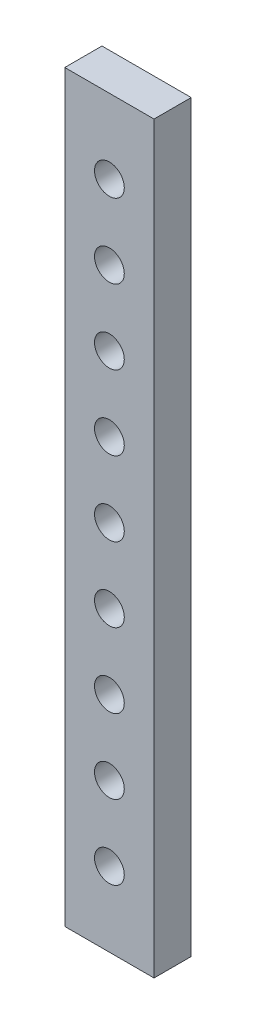
ISO-10303-21;
HEADER;
FILE_DESCRIPTION(('STEP AP214'),'2;1');
FILE_NAME('part.step','',(''),(''),'','','');
FILE_SCHEMA(('AUTOMOTIVE_DESIGN { 1 0 10303 214 1 1 1 1 }'));
ENDSEC;
DATA;
#1=APPLICATION_CONTEXT('core data for automotive mechanical design processes');
#2=APPLICATION_PROTOCOL_DEFINITION('international standard','automotive_design',2000,#1);
#3=PRODUCT_CONTEXT('',#1,'mechanical');
#4=PRODUCT('Part','Part','',(#3));
#5=PRODUCT_RELATED_PRODUCT_CATEGORY('part','',(#4));
#6=PRODUCT_DEFINITION_FORMATION('','',#4);
#7=PRODUCT_DEFINITION_CONTEXT('part definition',#1,'design');
#8=PRODUCT_DEFINITION('design','',#6,#7);
#9=PRODUCT_DEFINITION_SHAPE('','',#8);
#10=(LENGTH_UNIT() NAMED_UNIT(*) SI_UNIT(.MILLI.,.METRE.));
#11=(NAMED_UNIT(*) PLANE_ANGLE_UNIT() SI_UNIT($,.RADIAN.));
#12=(NAMED_UNIT(*) SI_UNIT($,.STERADIAN.) SOLID_ANGLE_UNIT());
#13=UNCERTAINTY_MEASURE_WITH_UNIT(LENGTH_MEASURE(1.E-05),#10,'distance_accuracy_value','');
#14=(GEOMETRIC_REPRESENTATION_CONTEXT(3) GLOBAL_UNCERTAINTY_ASSIGNED_CONTEXT((#13)) GLOBAL_UNIT_ASSIGNED_CONTEXT((#10,
#11,#12)) REPRESENTATION_CONTEXT('',''));
#15=CARTESIAN_POINT('',(0.,0.,0.));
#16=DIRECTION('',(0.,0.,1.));
#17=DIRECTION('',(1.,0.,0.));
#18=AXIS2_PLACEMENT_3D('',#15,#16,#17);
#19=CARTESIAN_POINT('',(0.,0.,5.));
#20=DIRECTION('',(0.,0.,1.));
#21=DIRECTION('',(1.,0.,0.));
#22=AXIS2_PLACEMENT_3D('',#19,#20,#21);
#23=PLANE('',#22);
#24=CARTESIAN_POINT('',(3.12396350297161E-13,-30.,5.));
#25=DIRECTION('',(0.,0.,1.));
#26=DIRECTION('',(1.,0.,0.));
#27=AXIS2_PLACEMENT_3D('',#24,#25,#26);
#28=CIRCLE('',#27,2.);
#29=CARTESIAN_POINT('',(2.00000000000031,-30.,5.));
#30=VERTEX_POINT('',#29);
#31=EDGE_CURVE('E182',#30,#30,#28,.T.);
#32=ORIENTED_EDGE('',*,*,#31,.F.);
#33=EDGE_LOOP('',(#32));
#34=FACE_BOUND('',#33,.T.);
#35=CARTESIAN_POINT('',(1.0413211676572E-13,-10.,5.));
#36=DIRECTION('',(0.,0.,1.));
#37=DIRECTION('',(1.,0.,0.));
#38=AXIS2_PLACEMENT_3D('',#35,#36,#37);
#39=CIRCLE('',#38,2.);
#40=CARTESIAN_POINT('',(2.0000000000001,-10.,5.));
#41=VERTEX_POINT('',#40);
#42=EDGE_CURVE('E166',#41,#41,#39,.T.);
#43=ORIENTED_EDGE('',*,*,#42,.F.);
#44=EDGE_LOOP('',(#43));
#45=FACE_BOUND('',#44,.T.);
#46=CARTESIAN_POINT('',(-1.02907469966573E-13,30.,5.));
#47=DIRECTION('',(0.,0.,1.));
#48=DIRECTION('',(1.,0.,0.));
#49=AXIS2_PLACEMENT_3D('',#46,#47,#48);
#50=CIRCLE('',#49,2.);
#51=CARTESIAN_POINT('',(1.9999999999999,30.,5.));
#52=VERTEX_POINT('',#51);
#53=EDGE_CURVE('E150',#52,#52,#50,.T.);
#54=ORIENTED_EDGE('',*,*,#53,.F.);
#55=EDGE_LOOP('',(#54));
#56=FACE_BOUND('',#55,.T.);
#57=CARTESIAN_POINT('',(0.,10.,5.));
#58=DIRECTION('',(0.,0.,1.));
#59=DIRECTION('',(1.,0.,0.));
#60=AXIS2_PLACEMENT_3D('',#57,#58,#59);
#61=CIRCLE('',#60,2.);
#62=CARTESIAN_POINT('',(1.99999999999997,10.,5.));
#63=VERTEX_POINT('',#62);
#64=EDGE_CURVE('E134',#63,#63,#61,.T.);
#65=ORIENTED_EDGE('',*,*,#64,.F.);
#66=EDGE_LOOP('',(#65));
#67=FACE_BOUND('',#66,.T.);
#68=DIRECTION('',(0.,1.,0.));
#69=VECTOR('',#68,1.);
#70=CARTESIAN_POINT('',(6.,50.,5.));
#71=LINE('',#70,#69);
#72=CARTESIAN_POINT('',(6.00000000000001,-50.,5.));
#73=VERTEX_POINT('',#72);
#74=CARTESIAN_POINT('',(6.,50.,5.));
#75=VERTEX_POINT('',#74);
#76=EDGE_CURVE('E92',#73,#75,#71,.T.);
#77=ORIENTED_EDGE('',*,*,#76,.T.);
#78=DIRECTION('',(-1.,0.,0.));
#79=VECTOR('',#78,1.);
#80=CARTESIAN_POINT('',(-6.,50.,5.));
#81=LINE('',#80,#79);
#82=CARTESIAN_POINT('',(-6.,50.,5.));
#83=VERTEX_POINT('',#82);
#84=EDGE_CURVE('E87',#75,#83,#81,.T.);
#85=ORIENTED_EDGE('',*,*,#84,.T.);
#86=DIRECTION('',(0.,-1.,0.));
#87=VECTOR('',#86,1.);
#88=CARTESIAN_POINT('',(-6.,50.,5.));
#89=LINE('',#88,#87);
#90=CARTESIAN_POINT('',(-5.99999999999999,-50.,5.));
#91=VERTEX_POINT('',#90);
#92=EDGE_CURVE('E90',#83,#91,#89,.T.);
#93=ORIENTED_EDGE('',*,*,#92,.T.);
#94=DIRECTION('',(1.,0.,0.));
#95=VECTOR('',#94,1.);
#96=CARTESIAN_POINT('',(-5.99999999999999,-50.,5.));
#97=LINE('',#96,#95);
#98=EDGE_CURVE('E57',#91,#73,#97,.T.);
#99=ORIENTED_EDGE('',*,*,#98,.T.);
#100=EDGE_LOOP('',(#77,#85,#93,#99));
#101=FACE_BOUND('',#100,.T.);
#102=CARTESIAN_POINT('',(0.,0.,5.));
#103=DIRECTION('',(0.,0.,1.));
#104=DIRECTION('',(1.,0.,0.));
#105=AXIS2_PLACEMENT_3D('',#102,#103,#104);
#106=CIRCLE('',#105,2.);
#107=CARTESIAN_POINT('',(2.,0.,5.));
#108=VERTEX_POINT('',#107);
#109=EDGE_CURVE('E112',#108,#108,#106,.T.);
#110=ORIENTED_EDGE('',*,*,#109,.F.);
#111=EDGE_LOOP('',(#110));
#112=FACE_BOUND('',#111,.T.);
#113=CARTESIAN_POINT('',(0.,20.,5.));
#114=DIRECTION('',(0.,0.,1.));
#115=DIRECTION('',(1.,0.,0.));
#116=AXIS2_PLACEMENT_3D('',#113,#114,#115);
#117=CIRCLE('',#116,2.);
#118=CARTESIAN_POINT('',(1.99999999999993,20.,5.));
#119=VERTEX_POINT('',#118);
#120=EDGE_CURVE('E142',#119,#119,#117,.T.);
#121=ORIENTED_EDGE('',*,*,#120,.F.);
#122=EDGE_LOOP('',(#121));
#123=FACE_BOUND('',#122,.T.);
#124=CARTESIAN_POINT('',(-1.37209959955431E-13,40.,5.));
#125=DIRECTION('',(0.,0.,1.));
#126=DIRECTION('',(1.,0.,0.));
#127=AXIS2_PLACEMENT_3D('',#124,#125,#126);
#128=CIRCLE('',#127,2.);
#129=CARTESIAN_POINT('',(1.99999999999986,40.,5.));
#130=VERTEX_POINT('',#129);
#131=EDGE_CURVE('E158',#130,#130,#128,.T.);
#132=ORIENTED_EDGE('',*,*,#131,.F.);
#133=EDGE_LOOP('',(#132));
#134=FACE_BOUND('',#133,.T.);
#135=CARTESIAN_POINT('',(2.08264233531441E-13,-20.,5.));
#136=DIRECTION('',(0.,0.,1.));
#137=DIRECTION('',(1.,0.,0.));
#138=AXIS2_PLACEMENT_3D('',#135,#136,#137);
#139=CIRCLE('',#138,2.);
#140=CARTESIAN_POINT('',(2.00000000000021,-20.,5.));
#141=VERTEX_POINT('',#140);
#142=EDGE_CURVE('E174',#141,#141,#139,.T.);
#143=ORIENTED_EDGE('',*,*,#142,.F.);
#144=EDGE_LOOP('',(#143));
#145=FACE_BOUND('',#144,.T.);
#146=CARTESIAN_POINT('',(4.16528467062881E-13,-40.,5.));
#147=DIRECTION('',(0.,0.,1.));
#148=DIRECTION('',(1.,0.,0.));
#149=AXIS2_PLACEMENT_3D('',#146,#147,#148);
#150=CIRCLE('',#149,2.);
#151=CARTESIAN_POINT('',(2.00000000000042,-40.,5.));
#152=VERTEX_POINT('',#151);
#153=EDGE_CURVE('E190',#152,#152,#150,.T.);
#154=ORIENTED_EDGE('',*,*,#153,.F.);
#155=EDGE_LOOP('',(#154));
#156=FACE_BOUND('',#155,.T.);
#157=ADVANCED_FACE('F39',(#34,#45,#56,#67,#101,#112,#123,#134,#145,#156),#23,.T.);
#158=CARTESIAN_POINT('',(0.,0.,0.));
#159=DIRECTION('',(0.,0.,1.));
#160=DIRECTION('',(1.,0.,0.));
#161=AXIS2_PLACEMENT_3D('',#158,#159,#160);
#162=PLANE('',#161);
#163=DIRECTION('',(0.,1.,0.));
#164=VECTOR('',#163,1.);
#165=CARTESIAN_POINT('',(6.,50.,0.));
#166=LINE('',#165,#164);
#167=CARTESIAN_POINT('',(6.00000000000001,-50.,0.));
#168=VERTEX_POINT('',#167);
#169=CARTESIAN_POINT('',(6.,50.,0.));
#170=VERTEX_POINT('',#169);
#171=EDGE_CURVE('E108',#168,#170,#166,.T.);
#172=ORIENTED_EDGE('',*,*,#171,.F.);
#173=DIRECTION('',(1.,0.,0.));
#174=VECTOR('',#173,1.);
#175=CARTESIAN_POINT('',(-5.99999999999999,-50.,0.));
#176=LINE('',#175,#174);
#177=CARTESIAN_POINT('',(-5.99999999999999,-50.,0.));
#178=VERTEX_POINT('',#177);
#179=EDGE_CURVE('E80',#178,#168,#176,.T.);
#180=ORIENTED_EDGE('',*,*,#179,.F.);
#181=DIRECTION('',(0.,-1.,0.));
#182=VECTOR('',#181,1.);
#183=CARTESIAN_POINT('',(-6.,50.,0.));
#184=LINE('',#183,#182);
#185=CARTESIAN_POINT('',(-6.,50.,0.));
#186=VERTEX_POINT('',#185);
#187=EDGE_CURVE('E74',#186,#178,#184,.T.);
#188=ORIENTED_EDGE('',*,*,#187,.F.);
#189=DIRECTION('',(-1.,0.,0.));
#190=VECTOR('',#189,1.);
#191=CARTESIAN_POINT('',(-6.,50.,0.));
#192=LINE('',#191,#190);
#193=EDGE_CURVE('E97',#170,#186,#192,.T.);
#194=ORIENTED_EDGE('',*,*,#193,.F.);
#195=EDGE_LOOP('',(#172,#180,#188,#194));
#196=FACE_BOUND('',#195,.T.);
#197=CARTESIAN_POINT('',(0.,0.,0.));
#198=DIRECTION('',(0.,0.,1.));
#199=DIRECTION('',(1.,0.,0.));
#200=AXIS2_PLACEMENT_3D('',#197,#198,#199);
#201=CIRCLE('',#200,2.);
#202=CARTESIAN_POINT('',(2.,0.,0.));
#203=VERTEX_POINT('',#202);
#204=EDGE_CURVE('E130',#203,#203,#201,.T.);
#205=ORIENTED_EDGE('',*,*,#204,.T.);
#206=EDGE_LOOP('',(#205));
#207=FACE_BOUND('',#206,.T.);
#208=CARTESIAN_POINT('',(0.,10.,0.));
#209=DIRECTION('',(0.,0.,1.));
#210=DIRECTION('',(1.,0.,0.));
#211=AXIS2_PLACEMENT_3D('',#208,#209,#210);
#212=CIRCLE('',#211,2.);
#213=CARTESIAN_POINT('',(1.99999999999997,10.,0.));
#214=VERTEX_POINT('',#213);
#215=EDGE_CURVE('E138',#214,#214,#212,.T.);
#216=ORIENTED_EDGE('',*,*,#215,.T.);
#217=EDGE_LOOP('',(#216));
#218=FACE_BOUND('',#217,.T.);
#219=CARTESIAN_POINT('',(0.,20.,0.));
#220=DIRECTION('',(0.,0.,1.));
#221=DIRECTION('',(1.,0.,0.));
#222=AXIS2_PLACEMENT_3D('',#219,#220,#221);
#223=CIRCLE('',#222,2.);
#224=CARTESIAN_POINT('',(1.99999999999993,20.,0.));
#225=VERTEX_POINT('',#224);
#226=EDGE_CURVE('E146',#225,#225,#223,.T.);
#227=ORIENTED_EDGE('',*,*,#226,.T.);
#228=EDGE_LOOP('',(#227));
#229=FACE_BOUND('',#228,.T.);
#230=CARTESIAN_POINT('',(-1.02907469966573E-13,30.,0.));
#231=DIRECTION('',(0.,0.,1.));
#232=DIRECTION('',(1.,0.,0.));
#233=AXIS2_PLACEMENT_3D('',#230,#231,#232);
#234=CIRCLE('',#233,2.);
#235=CARTESIAN_POINT('',(1.9999999999999,30.,0.));
#236=VERTEX_POINT('',#235);
#237=EDGE_CURVE('E154',#236,#236,#234,.T.);
#238=ORIENTED_EDGE('',*,*,#237,.T.);
#239=EDGE_LOOP('',(#238));
#240=FACE_BOUND('',#239,.T.);
#241=CARTESIAN_POINT('',(-1.37209959955431E-13,40.,0.));
#242=DIRECTION('',(0.,0.,1.));
#243=DIRECTION('',(1.,0.,0.));
#244=AXIS2_PLACEMENT_3D('',#241,#242,#243);
#245=CIRCLE('',#244,2.);
#246=CARTESIAN_POINT('',(1.99999999999986,40.,0.));
#247=VERTEX_POINT('',#246);
#248=EDGE_CURVE('E162',#247,#247,#245,.T.);
#249=ORIENTED_EDGE('',*,*,#248,.T.);
#250=EDGE_LOOP('',(#249));
#251=FACE_BOUND('',#250,.T.);
#252=CARTESIAN_POINT('',(1.0413211676572E-13,-10.,0.));
#253=DIRECTION('',(0.,0.,1.));
#254=DIRECTION('',(1.,0.,0.));
#255=AXIS2_PLACEMENT_3D('',#252,#253,#254);
#256=CIRCLE('',#255,2.);
#257=CARTESIAN_POINT('',(2.0000000000001,-10.,0.));
#258=VERTEX_POINT('',#257);
#259=EDGE_CURVE('E170',#258,#258,#256,.T.);
#260=ORIENTED_EDGE('',*,*,#259,.T.);
#261=EDGE_LOOP('',(#260));
#262=FACE_BOUND('',#261,.T.);
#263=CARTESIAN_POINT('',(2.08264233531441E-13,-20.,0.));
#264=DIRECTION('',(0.,0.,1.));
#265=DIRECTION('',(1.,0.,0.));
#266=AXIS2_PLACEMENT_3D('',#263,#264,#265);
#267=CIRCLE('',#266,2.);
#268=CARTESIAN_POINT('',(2.00000000000021,-20.,0.));
#269=VERTEX_POINT('',#268);
#270=EDGE_CURVE('E178',#269,#269,#267,.T.);
#271=ORIENTED_EDGE('',*,*,#270,.T.);
#272=EDGE_LOOP('',(#271));
#273=FACE_BOUND('',#272,.T.);
#274=CARTESIAN_POINT('',(3.12396350297161E-13,-30.,0.));
#275=DIRECTION('',(0.,0.,1.));
#276=DIRECTION('',(1.,0.,0.));
#277=AXIS2_PLACEMENT_3D('',#274,#275,#276);
#278=CIRCLE('',#277,2.);
#279=CARTESIAN_POINT('',(2.00000000000031,-30.,0.));
#280=VERTEX_POINT('',#279);
#281=EDGE_CURVE('E186',#280,#280,#278,.T.);
#282=ORIENTED_EDGE('',*,*,#281,.T.);
#283=EDGE_LOOP('',(#282));
#284=FACE_BOUND('',#283,.T.);
#285=CARTESIAN_POINT('',(4.16528467062881E-13,-40.,0.));
#286=DIRECTION('',(0.,0.,1.));
#287=DIRECTION('',(1.,0.,0.));
#288=AXIS2_PLACEMENT_3D('',#285,#286,#287);
#289=CIRCLE('',#288,2.);
#290=CARTESIAN_POINT('',(2.00000000000042,-40.,0.));
#291=VERTEX_POINT('',#290);
#292=EDGE_CURVE('E194',#291,#291,#289,.T.);
#293=ORIENTED_EDGE('',*,*,#292,.T.);
#294=EDGE_LOOP('',(#293));
#295=FACE_BOUND('',#294,.T.);
#296=ADVANCED_FACE('F125',(#196,#207,#218,#229,#240,#251,#262,#273,#284,#295),#162,.F.);
#297=CARTESIAN_POINT('',(6.,50.,5.));
#298=DIRECTION('',(-1.,0.,0.));
#299=DIRECTION('',(0.,-1.,0.));
#300=AXIS2_PLACEMENT_3D('',#297,#298,#299);
#301=PLANE('',#300);
#302=ORIENTED_EDGE('',*,*,#171,.T.);
#303=DIRECTION('',(0.,0.,-1.));
#304=VECTOR('',#303,1.);
#305=CARTESIAN_POINT('',(6.,50.,5.));
#306=LINE('',#305,#304);
#307=EDGE_CURVE('E11',#75,#170,#306,.T.);
#308=ORIENTED_EDGE('',*,*,#307,.F.);
#309=ORIENTED_EDGE('',*,*,#76,.F.);
#310=DIRECTION('',(0.,0.,-1.));
#311=VECTOR('',#310,1.);
#312=CARTESIAN_POINT('',(6.00000000000001,-50.,5.));
#313=LINE('',#312,#311);
#314=EDGE_CURVE('E104',#73,#168,#313,.T.);
#315=ORIENTED_EDGE('',*,*,#314,.T.);
#316=EDGE_LOOP('',(#302,#308,#309,#315));
#317=FACE_BOUND('',#316,.T.);
#318=ADVANCED_FACE('F41',(#317),#301,.F.);
#319=CARTESIAN_POINT('',(-6.,50.,5.));
#320=DIRECTION('',(0.,-1.,0.));
#321=DIRECTION('',(0.,0.,-1.));
#322=AXIS2_PLACEMENT_3D('',#319,#320,#321);
#323=PLANE('',#322);
#324=ORIENTED_EDGE('',*,*,#193,.T.);
#325=DIRECTION('',(0.,0.,-1.));
#326=VECTOR('',#325,1.);
#327=CARTESIAN_POINT('',(-6.,50.,5.));
#328=LINE('',#327,#326);
#329=EDGE_CURVE('E49',#83,#186,#328,.T.);
#330=ORIENTED_EDGE('',*,*,#329,.F.);
#331=ORIENTED_EDGE('',*,*,#84,.F.);
#332=ORIENTED_EDGE('',*,*,#307,.T.);
#333=EDGE_LOOP('',(#324,#330,#331,#332));
#334=FACE_BOUND('',#333,.T.);
#335=ADVANCED_FACE('F96',(#334),#323,.F.);
#336=CARTESIAN_POINT('',(-6.,50.,5.));
#337=DIRECTION('',(1.,0.,0.));
#338=DIRECTION('',(0.,1.,0.));
#339=AXIS2_PLACEMENT_3D('',#336,#337,#338);
#340=PLANE('',#339);
#341=ORIENTED_EDGE('',*,*,#187,.T.);
#342=DIRECTION('',(0.,0.,-1.));
#343=VECTOR('',#342,1.);
#344=CARTESIAN_POINT('',(-5.99999999999999,-50.,5.));
#345=LINE('',#344,#343);
#346=EDGE_CURVE('E99',#91,#178,#345,.T.);
#347=ORIENTED_EDGE('',*,*,#346,.F.);
#348=ORIENTED_EDGE('',*,*,#92,.F.);
#349=ORIENTED_EDGE('',*,*,#329,.T.);
#350=EDGE_LOOP('',(#341,#347,#348,#349));
#351=FACE_BOUND('',#350,.T.);
#352=ADVANCED_FACE('F100',(#351),#340,.F.);
#353=CARTESIAN_POINT('',(-5.99999999999999,-50.,5.));
#354=DIRECTION('',(0.,1.,0.));
#355=DIRECTION('',(0.,0.,1.));
#356=AXIS2_PLACEMENT_3D('',#353,#354,#355);
#357=PLANE('',#356);
#358=ORIENTED_EDGE('',*,*,#179,.T.);
#359=ORIENTED_EDGE('',*,*,#314,.F.);
#360=ORIENTED_EDGE('',*,*,#98,.F.);
#361=ORIENTED_EDGE('',*,*,#346,.T.);
#362=EDGE_LOOP('',(#358,#359,#360,#361));
#363=FACE_BOUND('',#362,.T.);
#364=ADVANCED_FACE('F122',(#363),#357,.F.);
#365=CARTESIAN_POINT('',(0.,0.,5.));
#366=DIRECTION('',(0.,0.,-1.));
#367=DIRECTION('',(-1.,0.,0.));
#368=AXIS2_PLACEMENT_3D('',#365,#366,#367);
#369=CYLINDRICAL_SURFACE('',#368,2.);
#370=ORIENTED_EDGE('',*,*,#109,.T.);
#371=EDGE_LOOP('',(#370));
#372=FACE_BOUND('',#371,.T.);
#373=ORIENTED_EDGE('',*,*,#204,.F.);
#374=EDGE_LOOP('',(#373));
#375=FACE_BOUND('',#374,.T.);
#376=ADVANCED_FACE('F215',(#372,#375),#369,.F.);
#377=CARTESIAN_POINT('',(0.,10.,5.));
#378=DIRECTION('',(0.,0.,-1.));
#379=DIRECTION('',(-1.,0.,0.));
#380=AXIS2_PLACEMENT_3D('',#377,#378,#379);
#381=CYLINDRICAL_SURFACE('',#380,2.);
#382=ORIENTED_EDGE('',*,*,#64,.T.);
#383=EDGE_LOOP('',(#382));
#384=FACE_BOUND('',#383,.T.);
#385=ORIENTED_EDGE('',*,*,#215,.F.);
#386=EDGE_LOOP('',(#385));
#387=FACE_BOUND('',#386,.T.);
#388=ADVANCED_FACE('F261',(#384,#387),#381,.F.);
#389=CARTESIAN_POINT('',(0.,20.,5.));
#390=DIRECTION('',(0.,0.,-1.));
#391=DIRECTION('',(-1.,0.,0.));
#392=AXIS2_PLACEMENT_3D('',#389,#390,#391);
#393=CYLINDRICAL_SURFACE('',#392,2.);
#394=ORIENTED_EDGE('',*,*,#120,.T.);
#395=EDGE_LOOP('',(#394));
#396=FACE_BOUND('',#395,.T.);
#397=ORIENTED_EDGE('',*,*,#226,.F.);
#398=EDGE_LOOP('',(#397));
#399=FACE_BOUND('',#398,.T.);
#400=ADVANCED_FACE('F269',(#396,#399),#393,.F.);
#401=CARTESIAN_POINT('',(-1.02907469966573E-13,30.,5.));
#402=DIRECTION('',(0.,0.,-1.));
#403=DIRECTION('',(-1.,0.,0.));
#404=AXIS2_PLACEMENT_3D('',#401,#402,#403);
#405=CYLINDRICAL_SURFACE('',#404,2.);
#406=ORIENTED_EDGE('',*,*,#53,.T.);
#407=EDGE_LOOP('',(#406));
#408=FACE_BOUND('',#407,.T.);
#409=ORIENTED_EDGE('',*,*,#237,.F.);
#410=EDGE_LOOP('',(#409));
#411=FACE_BOUND('',#410,.T.);
#412=ADVANCED_FACE('F277',(#408,#411),#405,.F.);
#413=CARTESIAN_POINT('',(-1.37209959955431E-13,40.,5.));
#414=DIRECTION('',(0.,0.,-1.));
#415=DIRECTION('',(-1.,0.,0.));
#416=AXIS2_PLACEMENT_3D('',#413,#414,#415);
#417=CYLINDRICAL_SURFACE('',#416,2.);
#418=ORIENTED_EDGE('',*,*,#131,.T.);
#419=EDGE_LOOP('',(#418));
#420=FACE_BOUND('',#419,.T.);
#421=ORIENTED_EDGE('',*,*,#248,.F.);
#422=EDGE_LOOP('',(#421));
#423=FACE_BOUND('',#422,.T.);
#424=ADVANCED_FACE('F286',(#420,#423),#417,.F.);
#425=CARTESIAN_POINT('',(1.0413211676572E-13,-10.,5.));
#426=DIRECTION('',(0.,0.,-1.));
#427=DIRECTION('',(-1.,0.,0.));
#428=AXIS2_PLACEMENT_3D('',#425,#426,#427);
#429=CYLINDRICAL_SURFACE('',#428,2.);
#430=ORIENTED_EDGE('',*,*,#42,.T.);
#431=EDGE_LOOP('',(#430));
#432=FACE_BOUND('',#431,.T.);
#433=ORIENTED_EDGE('',*,*,#259,.F.);
#434=EDGE_LOOP('',(#433));
#435=FACE_BOUND('',#434,.T.);
#436=ADVANCED_FACE('F295',(#432,#435),#429,.F.);
#437=CARTESIAN_POINT('',(2.08264233531441E-13,-20.,5.));
#438=DIRECTION('',(0.,0.,-1.));
#439=DIRECTION('',(-1.,0.,0.));
#440=AXIS2_PLACEMENT_3D('',#437,#438,#439);
#441=CYLINDRICAL_SURFACE('',#440,2.);
#442=ORIENTED_EDGE('',*,*,#142,.T.);
#443=EDGE_LOOP('',(#442));
#444=FACE_BOUND('',#443,.T.);
#445=ORIENTED_EDGE('',*,*,#270,.F.);
#446=EDGE_LOOP('',(#445));
#447=FACE_BOUND('',#446,.T.);
#448=ADVANCED_FACE('F304',(#444,#447),#441,.F.);
#449=CARTESIAN_POINT('',(3.12396350297161E-13,-30.,5.));
#450=DIRECTION('',(0.,0.,-1.));
#451=DIRECTION('',(-1.,0.,0.));
#452=AXIS2_PLACEMENT_3D('',#449,#450,#451);
#453=CYLINDRICAL_SURFACE('',#452,2.);
#454=ORIENTED_EDGE('',*,*,#31,.T.);
#455=EDGE_LOOP('',(#454));
#456=FACE_BOUND('',#455,.T.);
#457=ORIENTED_EDGE('',*,*,#281,.F.);
#458=EDGE_LOOP('',(#457));
#459=FACE_BOUND('',#458,.T.);
#460=ADVANCED_FACE('F313',(#456,#459),#453,.F.);
#461=CARTESIAN_POINT('',(4.16528467062881E-13,-40.,5.));
#462=DIRECTION('',(0.,0.,-1.));
#463=DIRECTION('',(-1.,0.,0.));
#464=AXIS2_PLACEMENT_3D('',#461,#462,#463);
#465=CYLINDRICAL_SURFACE('',#464,2.);
#466=ORIENTED_EDGE('',*,*,#153,.T.);
#467=EDGE_LOOP('',(#466));
#468=FACE_BOUND('',#467,.T.);
#469=ORIENTED_EDGE('',*,*,#292,.F.);
#470=EDGE_LOOP('',(#469));
#471=FACE_BOUND('',#470,.T.);
#472=ADVANCED_FACE('F202',(#468,#471),#465,.F.);
#473=CLOSED_SHELL('',(#157,#296,#318,#335,#352,#364,#376,#388,#400,#412,#424,#436,#448,#460,#472));
#474=MANIFOLD_SOLID_BREP('B2',#473);
#475=ADVANCED_BREP_SHAPE_REPRESENTATION('',(#18,#474),#14);
#476=SHAPE_DEFINITION_REPRESENTATION(#9,#475);
ENDSEC;
END-ISO-10303-21;
